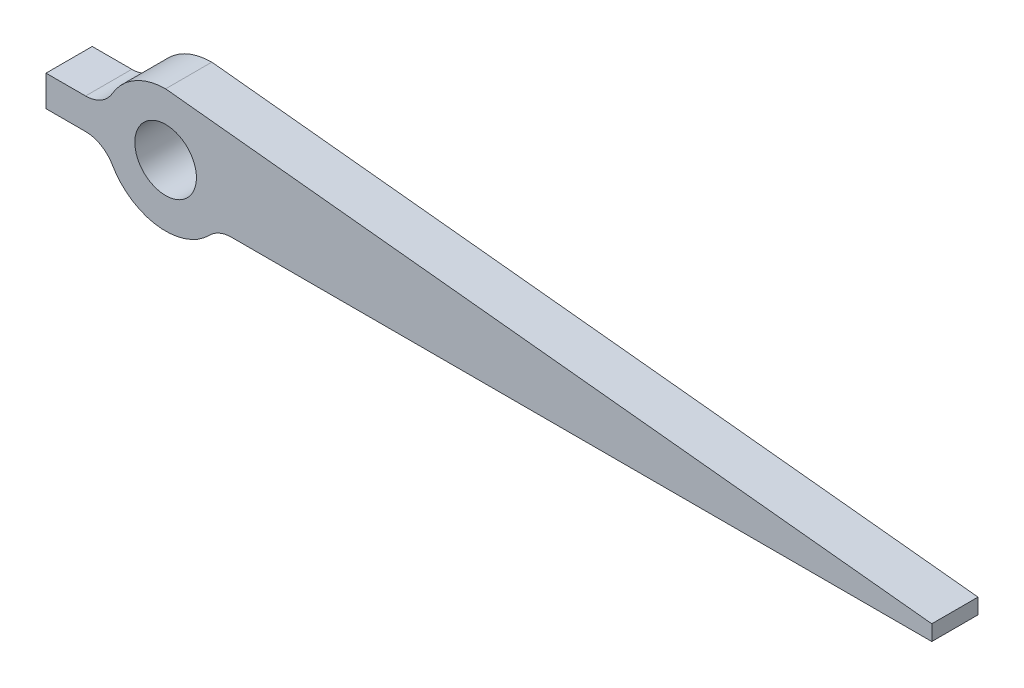
ISO-10303-21;
HEADER;
FILE_DESCRIPTION(('STEP AP214'),'2;1');
FILE_NAME('part.step','',(''),(''),'','','');
FILE_SCHEMA(('AUTOMOTIVE_DESIGN { 1 0 10303 214 1 1 1 1 }'));
ENDSEC;
DATA;
#1=APPLICATION_CONTEXT('core data for automotive mechanical design processes');
#2=APPLICATION_PROTOCOL_DEFINITION('international standard','automotive_design',2000,#1);
#3=PRODUCT_CONTEXT('',#1,'mechanical');
#4=PRODUCT('Part','Part','',(#3));
#5=PRODUCT_RELATED_PRODUCT_CATEGORY('part','',(#4));
#6=PRODUCT_DEFINITION_FORMATION('','',#4);
#7=PRODUCT_DEFINITION_CONTEXT('part definition',#1,'design');
#8=PRODUCT_DEFINITION('design','',#6,#7);
#9=PRODUCT_DEFINITION_SHAPE('','',#8);
#10=(LENGTH_UNIT() NAMED_UNIT(*) SI_UNIT(.MILLI.,.METRE.));
#11=(NAMED_UNIT(*) PLANE_ANGLE_UNIT() SI_UNIT($,.RADIAN.));
#12=(NAMED_UNIT(*) SI_UNIT($,.STERADIAN.) SOLID_ANGLE_UNIT());
#13=UNCERTAINTY_MEASURE_WITH_UNIT(LENGTH_MEASURE(1.E-05),#10,'distance_accuracy_value','');
#14=(GEOMETRIC_REPRESENTATION_CONTEXT(3) GLOBAL_UNCERTAINTY_ASSIGNED_CONTEXT((#13)) GLOBAL_UNIT_ASSIGNED_CONTEXT((#10,
#11,#12)) REPRESENTATION_CONTEXT('',''));
#15=CARTESIAN_POINT('',(0.,0.,0.));
#16=DIRECTION('',(0.,0.,1.));
#17=DIRECTION('',(1.,0.,0.));
#18=AXIS2_PLACEMENT_3D('',#15,#16,#17);
#19=CARTESIAN_POINT('',(1.80959474624118,17.2869736289204,1.5));
#20=DIRECTION('',(0.104110812603087,0.994565703560667,0.));
#21=DIRECTION('',(-0.994565703560667,0.104110812603087,0.));
#22=AXIS2_PLACEMENT_3D('',#19,#20,#21);
#23=PLANE('',#22);
#24=DIRECTION('',(0.994565703560667,-0.104110812603087,0.));
#25=VECTOR('',#24,1.);
#26=CARTESIAN_POINT('',(1.80959474624118,17.2869736289204,0.));
#27=LINE('',#26,#25);
#28=CARTESIAN_POINT('',(-11.2160550410776,18.6504943889727,0.));
#29=VERTEX_POINT('',#28);
#30=CARTESIAN_POINT('',(13.6480875479391,16.0477240738955,0.));
#31=VERTEX_POINT('',#30);
#32=EDGE_CURVE('E131',#29,#31,#27,.T.);
#33=ORIENTED_EDGE('',*,*,#32,.F.);
#34=DIRECTION('',(0.,0.,-1.));
#35=VECTOR('',#34,1.);
#36=CARTESIAN_POINT('',(-11.2160550410776,18.6504943889727,1.5));
#37=LINE('',#36,#35);
#38=CARTESIAN_POINT('',(-11.2160550410776,18.6504943889727,1.5));
#39=VERTEX_POINT('',#38);
#40=EDGE_CURVE('E125',#39,#29,#37,.T.);
#41=ORIENTED_EDGE('',*,*,#40,.F.);
#42=DIRECTION('',(0.994565703560667,-0.104110812603087,0.));
#43=VECTOR('',#42,1.);
#44=CARTESIAN_POINT('',(1.80959474624118,17.2869736289204,1.5));
#45=LINE('',#44,#43);
#46=CARTESIAN_POINT('',(13.6480875479391,16.0477240738955,1.5));
#47=VERTEX_POINT('',#46);
#48=EDGE_CURVE('E128',#39,#47,#45,.T.);
#49=ORIENTED_EDGE('',*,*,#48,.T.);
#50=DIRECTION('',(0.,0.,-1.));
#51=VECTOR('',#50,1.);
#52=CARTESIAN_POINT('',(13.6480875479391,16.0477240738955,1.5));
#53=LINE('',#52,#51);
#54=EDGE_CURVE('E184',#47,#31,#53,.T.);
#55=ORIENTED_EDGE('',*,*,#54,.T.);
#56=EDGE_LOOP('',(#33,#41,#49,#55));
#57=FACE_BOUND('',#56,.T.);
#58=ADVANCED_FACE('F41',(#57),#23,.T.);
#59=CARTESIAN_POINT('',(-11.2160550410776,16.6504943889727,1.5));
#60=DIRECTION('',(0.,0.,-1.));
#61=DIRECTION('',(-1.,0.,0.));
#62=AXIS2_PLACEMENT_3D('',#59,#60,#61);
#63=CYLINDRICAL_SURFACE('',#62,2.);
#64=CARTESIAN_POINT('',(-11.2160550410776,16.6504943889727,0.));
#65=DIRECTION('',(0.,0.,1.));
#66=DIRECTION('',(1.,0.,0.));
#67=AXIS2_PLACEMENT_3D('',#64,#65,#66);
#68=CIRCLE('',#67,2.);
#69=CARTESIAN_POINT('',(-12.9481058486464,17.6504943889727,0.));
#70=VERTEX_POINT('',#69);
#71=EDGE_CURVE('E187',#29,#70,#68,.T.);
#72=ORIENTED_EDGE('',*,*,#71,.T.);
#73=DIRECTION('',(0.,0.,-1.));
#74=VECTOR('',#73,1.);
#75=CARTESIAN_POINT('',(-12.9481058486464,17.6504943889727,1.5));
#76=LINE('',#75,#74);
#77=CARTESIAN_POINT('',(-12.9481058486464,17.6504943889727,1.5));
#78=VERTEX_POINT('',#77);
#79=EDGE_CURVE('E143',#70,#78,#76,.F.);
#80=ORIENTED_EDGE('',*,*,#79,.T.);
#81=CARTESIAN_POINT('',(-11.2160550410776,16.6504943889727,1.5));
#82=DIRECTION('',(0.,0.,1.));
#83=DIRECTION('',(1.,0.,0.));
#84=AXIS2_PLACEMENT_3D('',#81,#82,#83);
#85=CIRCLE('',#84,2.);
#86=EDGE_CURVE('E140',#39,#78,#85,.T.);
#87=ORIENTED_EDGE('',*,*,#86,.F.);
#88=ORIENTED_EDGE('',*,*,#40,.T.);
#89=EDGE_LOOP('',(#72,#80,#87,#88));
#90=FACE_BOUND('',#89,.T.);
#91=ADVANCED_FACE('F141',(#90),#63,.T.);
#92=CARTESIAN_POINT('',(0.,17.1504943889727,1.5));
#93=DIRECTION('',(0.,1.,0.));
#94=DIRECTION('',(0.,0.,1.));
#95=AXIS2_PLACEMENT_3D('',#92,#93,#94);
#96=PLANE('',#95);
#97=DIRECTION('',(1.,0.,0.));
#98=VECTOR('',#97,1.);
#99=CARTESIAN_POINT('',(0.,17.1504943889727,1.5));
#100=LINE('',#99,#98);
#101=CARTESIAN_POINT('',(-15.0981058486465,17.1504943889727,1.5));
#102=VERTEX_POINT('',#101);
#103=CARTESIAN_POINT('',(-13.8141312524309,17.1504943889727,1.5));
#104=VERTEX_POINT('',#103);
#105=EDGE_CURVE('E147',#102,#104,#100,.T.);
#106=ORIENTED_EDGE('',*,*,#105,.T.);
#107=DIRECTION('',(0.,0.,-1.));
#108=VECTOR('',#107,1.);
#109=CARTESIAN_POINT('',(-13.8141312524309,17.1504943889727,1.5));
#110=LINE('',#109,#108);
#111=CARTESIAN_POINT('',(-13.8141312524309,17.1504943889727,0.));
#112=VERTEX_POINT('',#111);
#113=EDGE_CURVE('E231',#104,#112,#110,.T.);
#114=ORIENTED_EDGE('',*,*,#113,.T.);
#115=DIRECTION('',(1.,0.,0.));
#116=VECTOR('',#115,1.);
#117=CARTESIAN_POINT('',(0.,17.1504943889727,0.));
#118=LINE('',#117,#116);
#119=CARTESIAN_POINT('',(-15.0981058486465,17.1504943889727,0.));
#120=VERTEX_POINT('',#119);
#121=EDGE_CURVE('E190',#120,#112,#118,.T.);
#122=ORIENTED_EDGE('',*,*,#121,.F.);
#123=DIRECTION('',(0.,0.,-1.));
#124=VECTOR('',#123,1.);
#125=CARTESIAN_POINT('',(-15.0981058486465,17.1504943889727,1.5));
#126=LINE('',#125,#124);
#127=EDGE_CURVE('E137',#102,#120,#126,.T.);
#128=ORIENTED_EDGE('',*,*,#127,.F.);
#129=EDGE_LOOP('',(#106,#114,#122,#128));
#130=FACE_BOUND('',#129,.T.);
#131=ADVANCED_FACE('F279',(#130),#96,.T.);
#132=CARTESIAN_POINT('',(-15.0981058486465,0.,1.5));
#133=DIRECTION('',(-1.,0.,0.));
#134=DIRECTION('',(0.,0.,1.));
#135=AXIS2_PLACEMENT_3D('',#132,#133,#134);
#136=PLANE('',#135);
#137=DIRECTION('',(0.,1.,0.));
#138=VECTOR('',#137,1.);
#139=CARTESIAN_POINT('',(-15.0981058486465,0.,0.));
#140=LINE('',#139,#138);
#141=CARTESIAN_POINT('',(-15.0981058486465,16.1504943889727,0.));
#142=VERTEX_POINT('',#141);
#143=EDGE_CURVE('E195',#142,#120,#140,.T.);
#144=ORIENTED_EDGE('',*,*,#143,.F.);
#145=DIRECTION('',(0.,0.,-1.));
#146=VECTOR('',#145,1.);
#147=CARTESIAN_POINT('',(-15.0981058486465,16.1504943889727,1.5));
#148=LINE('',#147,#146);
#149=CARTESIAN_POINT('',(-15.0981058486465,16.1504943889727,1.5));
#150=VERTEX_POINT('',#149);
#151=EDGE_CURVE('E214',#150,#142,#148,.T.);
#152=ORIENTED_EDGE('',*,*,#151,.F.);
#153=DIRECTION('',(0.,1.,0.));
#154=VECTOR('',#153,1.);
#155=CARTESIAN_POINT('',(-15.0981058486465,0.,1.5));
#156=LINE('',#155,#154);
#157=EDGE_CURVE('E166',#150,#102,#156,.T.);
#158=ORIENTED_EDGE('',*,*,#157,.T.);
#159=ORIENTED_EDGE('',*,*,#127,.T.);
#160=EDGE_LOOP('',(#144,#152,#158,#159));
#161=FACE_BOUND('',#160,.T.);
#162=ADVANCED_FACE('F300',(#161),#136,.T.);
#163=CARTESIAN_POINT('',(0.,16.1504943889727,1.5));
#164=DIRECTION('',(0.,1.,0.));
#165=DIRECTION('',(0.,0.,1.));
#166=AXIS2_PLACEMENT_3D('',#163,#164,#165);
#167=PLANE('',#166);
#168=DIRECTION('',(1.,0.,0.));
#169=VECTOR('',#168,1.);
#170=CARTESIAN_POINT('',(0.,16.1504943889727,0.));
#171=LINE('',#170,#169);
#172=CARTESIAN_POINT('',(-13.8141312524309,16.1504943889727,0.));
#173=VERTEX_POINT('',#172);
#174=EDGE_CURVE('E199',#142,#173,#171,.T.);
#175=ORIENTED_EDGE('',*,*,#174,.T.);
#176=DIRECTION('',(0.,0.,1.));
#177=VECTOR('',#176,1.);
#178=CARTESIAN_POINT('',(-13.8141312524309,16.1504943889727,1.5));
#179=LINE('',#178,#177);
#180=CARTESIAN_POINT('',(-13.8141312524309,16.1504943889727,1.5));
#181=VERTEX_POINT('',#180);
#182=EDGE_CURVE('E222',#173,#181,#179,.T.);
#183=ORIENTED_EDGE('',*,*,#182,.T.);
#184=DIRECTION('',(1.,0.,0.));
#185=VECTOR('',#184,1.);
#186=CARTESIAN_POINT('',(0.,16.1504943889727,1.5));
#187=LINE('',#186,#185);
#188=EDGE_CURVE('E170',#150,#181,#187,.T.);
#189=ORIENTED_EDGE('',*,*,#188,.F.);
#190=ORIENTED_EDGE('',*,*,#151,.T.);
#191=EDGE_LOOP('',(#175,#183,#189,#190));
#192=FACE_BOUND('',#191,.T.);
#193=ADVANCED_FACE('F306',(#192),#167,.F.);
#194=CARTESIAN_POINT('',(-12.9481058486465,15.6504943889727,0.));
#195=VERTEX_POINT('',#194);
#196=CARTESIAN_POINT('',(-9.78958200094131,15.2486475122546,0.));
#197=VERTEX_POINT('',#196);
#198=EDGE_CURVE('E191',#195,#197,#68,.T.);
#199=ORIENTED_EDGE('',*,*,#198,.T.);
#200=DIRECTION('',(0.,0.,-1.));
#201=VECTOR('',#200,1.);
#202=CARTESIAN_POINT('',(-9.78958200094131,15.2486475122546,1.5));
#203=LINE('',#202,#201);
#204=CARTESIAN_POINT('',(-9.78958200094131,15.2486475122546,1.5));
#205=VERTEX_POINT('',#204);
#206=EDGE_CURVE('E63',#197,#205,#203,.F.);
#207=ORIENTED_EDGE('',*,*,#206,.T.);
#208=CARTESIAN_POINT('',(-12.9481058486465,15.6504943889727,1.5));
#209=VERTEX_POINT('',#208);
#210=EDGE_CURVE('E149',#209,#205,#85,.T.);
#211=ORIENTED_EDGE('',*,*,#210,.F.);
#212=DIRECTION('',(0.,0.,-1.));
#213=VECTOR('',#212,1.);
#214=CARTESIAN_POINT('',(-12.9481058486465,15.6504943889727,1.5));
#215=LINE('',#214,#213);
#216=EDGE_CURVE('E136',#209,#195,#215,.T.);
#217=ORIENTED_EDGE('',*,*,#216,.T.);
#218=EDGE_LOOP('',(#199,#207,#211,#217));
#219=FACE_BOUND('',#218,.T.);
#220=ADVANCED_FACE('F272',(#219),#63,.T.);
#221=CARTESIAN_POINT('',(0.,15.5477240738955,1.5));
#222=DIRECTION('',(0.,-1.,0.));
#223=DIRECTION('',(0.,0.,-1.));
#224=AXIS2_PLACEMENT_3D('',#221,#222,#223);
#225=PLANE('',#224);
#226=DIRECTION('',(-1.,0.,0.));
#227=VECTOR('',#226,1.);
#228=CARTESIAN_POINT('',(0.,15.5477240738955,1.5));
#229=LINE('',#228,#227);
#230=CARTESIAN_POINT('',(13.6480875479391,15.5477240738955,1.5));
#231=VERTEX_POINT('',#230);
#232=CARTESIAN_POINT('',(-9.07634548087317,15.5477240738955,1.5));
#233=VERTEX_POINT('',#232);
#234=EDGE_CURVE('E174',#231,#233,#229,.T.);
#235=ORIENTED_EDGE('',*,*,#234,.T.);
#236=DIRECTION('',(0.,0.,-1.));
#237=VECTOR('',#236,1.);
#238=CARTESIAN_POINT('',(-9.07634548087317,15.5477240738955,1.5));
#239=LINE('',#238,#237);
#240=CARTESIAN_POINT('',(-9.07634548087317,15.5477240738955,0.));
#241=VERTEX_POINT('',#240);
#242=EDGE_CURVE('E243',#233,#241,#239,.T.);
#243=ORIENTED_EDGE('',*,*,#242,.T.);
#244=DIRECTION('',(-1.,0.,0.));
#245=VECTOR('',#244,1.);
#246=CARTESIAN_POINT('',(0.,15.5477240738955,0.));
#247=LINE('',#246,#245);
#248=CARTESIAN_POINT('',(13.6480875479391,15.5477240738955,0.));
#249=VERTEX_POINT('',#248);
#250=EDGE_CURVE('E203',#249,#241,#247,.T.);
#251=ORIENTED_EDGE('',*,*,#250,.F.);
#252=DIRECTION('',(0.,0.,-1.));
#253=VECTOR('',#252,1.);
#254=CARTESIAN_POINT('',(13.6480875479391,15.5477240738955,1.5));
#255=LINE('',#254,#253);
#256=EDGE_CURVE('E211',#231,#249,#255,.T.);
#257=ORIENTED_EDGE('',*,*,#256,.F.);
#258=EDGE_LOOP('',(#235,#243,#251,#257));
#259=FACE_BOUND('',#258,.T.);
#260=ADVANCED_FACE('F257',(#259),#225,.T.);
#261=CARTESIAN_POINT('',(13.6480875479391,0.,1.5));
#262=DIRECTION('',(1.,0.,0.));
#263=DIRECTION('',(0.,0.,-1.));
#264=AXIS2_PLACEMENT_3D('',#261,#262,#263);
#265=PLANE('',#264);
#266=DIRECTION('',(0.,-1.,0.));
#267=VECTOR('',#266,1.);
#268=CARTESIAN_POINT('',(13.6480875479391,0.,0.));
#269=LINE('',#268,#267);
#270=EDGE_CURVE('E160',#31,#249,#269,.T.);
#271=ORIENTED_EDGE('',*,*,#270,.F.);
#272=ORIENTED_EDGE('',*,*,#54,.F.);
#273=DIRECTION('',(0.,-1.,0.));
#274=VECTOR('',#273,1.);
#275=CARTESIAN_POINT('',(13.6480875479391,0.,1.5));
#276=LINE('',#275,#274);
#277=EDGE_CURVE('E154',#47,#231,#276,.T.);
#278=ORIENTED_EDGE('',*,*,#277,.T.);
#279=ORIENTED_EDGE('',*,*,#256,.T.);
#280=EDGE_LOOP('',(#271,#272,#278,#279));
#281=FACE_BOUND('',#280,.T.);
#282=ADVANCED_FACE('F262',(#281),#265,.T.);
#283=CARTESIAN_POINT('',(-11.2160550410776,16.6504943889727,1.5));
#284=DIRECTION('',(0.,0.,-1.));
#285=DIRECTION('',(-1.,0.,0.));
#286=AXIS2_PLACEMENT_3D('',#283,#284,#285);
#287=CYLINDRICAL_SURFACE('',#286,1.);
#288=CARTESIAN_POINT('',(-11.2160550410776,16.6504943889727,1.5));
#289=DIRECTION('',(0.,0.,1.));
#290=DIRECTION('',(1.,0.,0.));
#291=AXIS2_PLACEMENT_3D('',#288,#289,#290);
#292=CIRCLE('',#291,1.);
#293=CARTESIAN_POINT('',(-10.2160550410776,16.6504943889727,1.5));
#294=VERTEX_POINT('',#293);
#295=EDGE_CURVE('E180',#294,#294,#292,.T.);
#296=ORIENTED_EDGE('',*,*,#295,.T.);
#297=EDGE_LOOP('',(#296));
#298=FACE_BOUND('',#297,.T.);
#299=CARTESIAN_POINT('',(-11.2160550410776,16.6504943889727,0.));
#300=DIRECTION('',(0.,0.,1.));
#301=DIRECTION('',(1.,0.,0.));
#302=AXIS2_PLACEMENT_3D('',#299,#300,#301);
#303=CIRCLE('',#302,1.);
#304=CARTESIAN_POINT('',(-10.2160550410776,16.6504943889727,0.));
#305=VERTEX_POINT('',#304);
#306=EDGE_CURVE('E156',#305,#305,#303,.T.);
#307=ORIENTED_EDGE('',*,*,#306,.F.);
#308=EDGE_LOOP('',(#307));
#309=FACE_BOUND('',#308,.T.);
#310=ADVANCED_FACE('F264',(#298,#309),#287,.F.);
#311=CARTESIAN_POINT('',(0.,0.,1.5));
#312=DIRECTION('',(0.,0.,1.));
#313=DIRECTION('',(1.,0.,0.));
#314=AXIS2_PLACEMENT_3D('',#311,#312,#313);
#315=PLANE('',#314);
#316=ORIENTED_EDGE('',*,*,#48,.F.);
#317=ORIENTED_EDGE('',*,*,#86,.T.);
#318=CARTESIAN_POINT('',(-13.8141312524309,18.1504943889727,1.5));
#319=DIRECTION('',(0.,0.,1.));
#320=DIRECTION('',(1.,0.,0.));
#321=AXIS2_PLACEMENT_3D('',#318,#319,#320);
#322=CIRCLE('',#321,1.);
#323=EDGE_CURVE('E240',#78,#104,#322,.F.);
#324=ORIENTED_EDGE('',*,*,#323,.T.);
#325=ORIENTED_EDGE('',*,*,#105,.F.);
#326=ORIENTED_EDGE('',*,*,#157,.F.);
#327=ORIENTED_EDGE('',*,*,#188,.T.);
#328=CARTESIAN_POINT('',(-13.8141312524309,15.1504943889727,1.5));
#329=DIRECTION('',(0.,0.,1.));
#330=DIRECTION('',(1.,0.,0.));
#331=AXIS2_PLACEMENT_3D('',#328,#329,#330);
#332=CIRCLE('',#331,1.);
#333=EDGE_CURVE('E228',#181,#209,#332,.F.);
#334=ORIENTED_EDGE('',*,*,#333,.T.);
#335=ORIENTED_EDGE('',*,*,#210,.T.);
#336=CARTESIAN_POINT('',(-9.07634548087317,14.5477240738955,1.5));
#337=DIRECTION('',(0.,0.,1.));
#338=DIRECTION('',(1.,0.,0.));
#339=AXIS2_PLACEMENT_3D('',#336,#337,#338);
#340=CIRCLE('',#339,1.);
#341=EDGE_CURVE('E11',#205,#233,#340,.F.);
#342=ORIENTED_EDGE('',*,*,#341,.T.);
#343=ORIENTED_EDGE('',*,*,#234,.F.);
#344=ORIENTED_EDGE('',*,*,#277,.F.);
#345=EDGE_LOOP('',(#316,#317,#324,#325,#326,#327,#334,#335,#342,#343,#344));
#346=FACE_BOUND('',#345,.T.);
#347=ORIENTED_EDGE('',*,*,#295,.F.);
#348=EDGE_LOOP('',(#347));
#349=FACE_BOUND('',#348,.T.);
#350=ADVANCED_FACE('F150',(#346,#349),#315,.T.);
#351=CARTESIAN_POINT('',(0.,0.,0.));
#352=DIRECTION('',(0.,0.,1.));
#353=DIRECTION('',(1.,0.,0.));
#354=AXIS2_PLACEMENT_3D('',#351,#352,#353);
#355=PLANE('',#354);
#356=ORIENTED_EDGE('',*,*,#32,.T.);
#357=ORIENTED_EDGE('',*,*,#270,.T.);
#358=ORIENTED_EDGE('',*,*,#250,.T.);
#359=CARTESIAN_POINT('',(-9.07634548087317,14.5477240738955,0.));
#360=DIRECTION('',(0.,0.,1.));
#361=DIRECTION('',(1.,0.,0.));
#362=AXIS2_PLACEMENT_3D('',#359,#360,#361);
#363=CIRCLE('',#362,1.);
#364=EDGE_CURVE('E50',#241,#197,#363,.T.);
#365=ORIENTED_EDGE('',*,*,#364,.T.);
#366=ORIENTED_EDGE('',*,*,#198,.F.);
#367=CARTESIAN_POINT('',(-13.8141312524309,15.1504943889727,0.));
#368=DIRECTION('',(0.,0.,1.));
#369=DIRECTION('',(1.,0.,0.));
#370=AXIS2_PLACEMENT_3D('',#367,#368,#369);
#371=CIRCLE('',#370,1.);
#372=EDGE_CURVE('E225',#195,#173,#371,.T.);
#373=ORIENTED_EDGE('',*,*,#372,.T.);
#374=ORIENTED_EDGE('',*,*,#174,.F.);
#375=ORIENTED_EDGE('',*,*,#143,.T.);
#376=ORIENTED_EDGE('',*,*,#121,.T.);
#377=CARTESIAN_POINT('',(-13.8141312524309,18.1504943889727,0.));
#378=DIRECTION('',(0.,0.,1.));
#379=DIRECTION('',(1.,0.,0.));
#380=AXIS2_PLACEMENT_3D('',#377,#378,#379);
#381=CIRCLE('',#380,1.);
#382=EDGE_CURVE('E237',#112,#70,#381,.T.);
#383=ORIENTED_EDGE('',*,*,#382,.T.);
#384=ORIENTED_EDGE('',*,*,#71,.F.);
#385=EDGE_LOOP('',(#356,#357,#358,#365,#366,#373,#374,#375,#376,#383,#384));
#386=FACE_BOUND('',#385,.T.);
#387=ORIENTED_EDGE('',*,*,#306,.T.);
#388=EDGE_LOOP('',(#387));
#389=FACE_BOUND('',#388,.T.);
#390=ADVANCED_FACE('F258',(#386,#389),#355,.F.);
#391=CARTESIAN_POINT('',(-13.8141312524309,15.1504943889727,1.5));
#392=DIRECTION('',(0.,0.,-1.));
#393=DIRECTION('',(-1.,0.,0.));
#394=AXIS2_PLACEMENT_3D('',#391,#392,#393);
#395=CYLINDRICAL_SURFACE('',#394,1.);
#396=ORIENTED_EDGE('',*,*,#333,.F.);
#397=ORIENTED_EDGE('',*,*,#182,.F.);
#398=ORIENTED_EDGE('',*,*,#372,.F.);
#399=ORIENTED_EDGE('',*,*,#216,.F.);
#400=EDGE_LOOP('',(#396,#397,#398,#399));
#401=FACE_BOUND('',#400,.T.);
#402=ADVANCED_FACE('F284',(#401),#395,.F.);
#403=CARTESIAN_POINT('',(-13.8141312524309,18.1504943889727,1.5));
#404=DIRECTION('',(0.,0.,-1.));
#405=DIRECTION('',(-1.,0.,0.));
#406=AXIS2_PLACEMENT_3D('',#403,#404,#405);
#407=CYLINDRICAL_SURFACE('',#406,1.);
#408=ORIENTED_EDGE('',*,*,#323,.F.);
#409=ORIENTED_EDGE('',*,*,#79,.F.);
#410=ORIENTED_EDGE('',*,*,#382,.F.);
#411=ORIENTED_EDGE('',*,*,#113,.F.);
#412=EDGE_LOOP('',(#408,#409,#410,#411));
#413=FACE_BOUND('',#412,.T.);
#414=ADVANCED_FACE('F286',(#413),#407,.F.);
#415=CARTESIAN_POINT('',(-9.07634548087317,14.5477240738955,1.5));
#416=DIRECTION('',(0.,0.,-1.));
#417=DIRECTION('',(-1.,0.,0.));
#418=AXIS2_PLACEMENT_3D('',#415,#416,#417);
#419=CYLINDRICAL_SURFACE('',#418,1.);
#420=ORIENTED_EDGE('',*,*,#341,.F.);
#421=ORIENTED_EDGE('',*,*,#206,.F.);
#422=ORIENTED_EDGE('',*,*,#364,.F.);
#423=ORIENTED_EDGE('',*,*,#242,.F.);
#424=EDGE_LOOP('',(#420,#421,#422,#423));
#425=FACE_BOUND('',#424,.T.);
#426=ADVANCED_FACE('F43',(#425),#419,.F.);
#427=CLOSED_SHELL('',(#58,#91,#131,#162,#193,#220,#260,#282,#310,#350,#390,#402,#414,#426));
#428=MANIFOLD_SOLID_BREP('B2',#427);
#429=ADVANCED_BREP_SHAPE_REPRESENTATION('',(#18,#428),#14);
#430=SHAPE_DEFINITION_REPRESENTATION(#9,#429);
ENDSEC;
END-ISO-10303-21;
